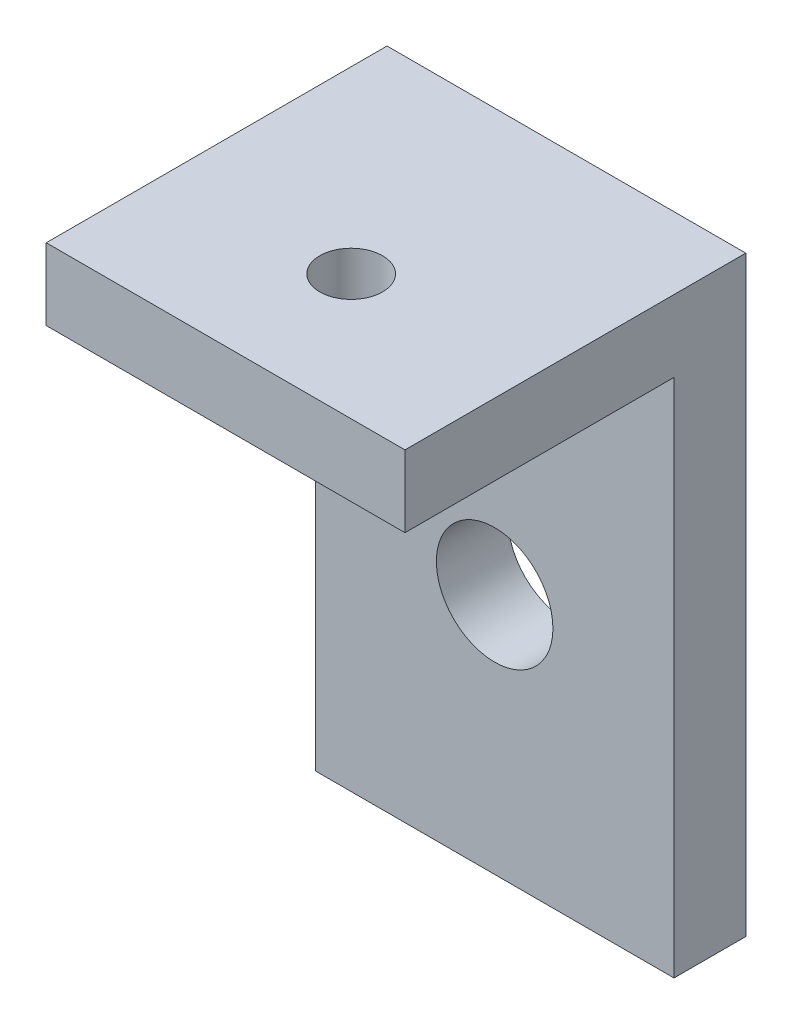
ISO-10303-21;
HEADER;
FILE_DESCRIPTION(('STEP AP214'),'2;1');
FILE_NAME('part.step','',(''),(''),'','','');
FILE_SCHEMA(('AUTOMOTIVE_DESIGN { 1 0 10303 214 1 1 1 1 }'));
ENDSEC;
DATA;
#1=APPLICATION_CONTEXT('core data for automotive mechanical design processes');
#2=APPLICATION_PROTOCOL_DEFINITION('international standard','automotive_design',2000,#1);
#3=PRODUCT_CONTEXT('',#1,'mechanical');
#4=PRODUCT('Part','Part','',(#3));
#5=PRODUCT_RELATED_PRODUCT_CATEGORY('part','',(#4));
#6=PRODUCT_DEFINITION_FORMATION('','',#4);
#7=PRODUCT_DEFINITION_CONTEXT('part definition',#1,'design');
#8=PRODUCT_DEFINITION('design','',#6,#7);
#9=PRODUCT_DEFINITION_SHAPE('','',#8);
#10=(LENGTH_UNIT() NAMED_UNIT(*) SI_UNIT(.MILLI.,.METRE.));
#11=(NAMED_UNIT(*) PLANE_ANGLE_UNIT() SI_UNIT($,.RADIAN.));
#12=(NAMED_UNIT(*) SI_UNIT($,.STERADIAN.) SOLID_ANGLE_UNIT());
#13=UNCERTAINTY_MEASURE_WITH_UNIT(LENGTH_MEASURE(1.E-05),#10,'distance_accuracy_value','');
#14=(GEOMETRIC_REPRESENTATION_CONTEXT(3) GLOBAL_UNCERTAINTY_ASSIGNED_CONTEXT((#13)) GLOBAL_UNIT_ASSIGNED_CONTEXT((#10,
#11,#12)) REPRESENTATION_CONTEXT('',''));
#15=CARTESIAN_POINT('',(0.,0.,0.));
#16=DIRECTION('',(0.,0.,1.));
#17=DIRECTION('',(1.,0.,0.));
#18=AXIS2_PLACEMENT_3D('',#15,#16,#17);
#19=CARTESIAN_POINT('',(0.,0.,4.));
#20=DIRECTION('',(0.,0.,-1.));
#21=DIRECTION('',(-1.,0.,0.));
#22=AXIS2_PLACEMENT_3D('',#19,#20,#21);
#23=PLANE('',#22);
#24=CARTESIAN_POINT('',(10.,13.5,4.));
#25=DIRECTION('',(0.,0.,1.));
#26=DIRECTION('',(1.,0.,0.));
#27=AXIS2_PLACEMENT_3D('',#24,#25,#26);
#28=CIRCLE('',#27,3.25);
#29=CARTESIAN_POINT('',(13.25,13.5,4.));
#30=VERTEX_POINT('',#29);
#31=EDGE_CURVE('E96',#30,#30,#28,.T.);
#32=ORIENTED_EDGE('',*,*,#31,.F.);
#33=EDGE_LOOP('',(#32));
#34=FACE_BOUND('',#33,.T.);
#35=DIRECTION('',(1.,0.,0.));
#36=VECTOR('',#35,1.);
#37=CARTESIAN_POINT('',(0.,29.,4.));
#38=LINE('',#37,#36);
#39=CARTESIAN_POINT('',(0.,29.,4.));
#40=VERTEX_POINT('',#39);
#41=CARTESIAN_POINT('',(20.,29.,4.));
#42=VERTEX_POINT('',#41);
#43=EDGE_CURVE('E49',#40,#42,#38,.T.);
#44=ORIENTED_EDGE('',*,*,#43,.F.);
#45=DIRECTION('',(0.,-1.,0.));
#46=VECTOR('',#45,1.);
#47=CARTESIAN_POINT('',(0.,0.,4.));
#48=LINE('',#47,#46);
#49=CARTESIAN_POINT('',(0.,0.,4.));
#50=VERTEX_POINT('',#49);
#51=EDGE_CURVE('E54',#40,#50,#48,.T.);
#52=ORIENTED_EDGE('',*,*,#51,.T.);
#53=DIRECTION('',(1.,0.,0.));
#54=VECTOR('',#53,1.);
#55=CARTESIAN_POINT('',(20.,0.,4.));
#56=LINE('',#55,#54);
#57=CARTESIAN_POINT('',(20.,0.,4.));
#58=VERTEX_POINT('',#57);
#59=EDGE_CURVE('E85',#50,#58,#56,.T.);
#60=ORIENTED_EDGE('',*,*,#59,.T.);
#61=DIRECTION('',(0.,1.,0.));
#62=VECTOR('',#61,1.);
#63=CARTESIAN_POINT('',(20.,33.,4.));
#64=LINE('',#63,#62);
#65=EDGE_CURVE('E144',#58,#42,#64,.T.);
#66=ORIENTED_EDGE('',*,*,#65,.T.);
#67=EDGE_LOOP('',(#44,#52,#60,#66));
#68=FACE_BOUND('',#67,.T.);
#69=ADVANCED_FACE('F33',(#34,#68),#23,.F.);
#70=CARTESIAN_POINT('',(0.,0.,0.));
#71=DIRECTION('',(0.,0.,-1.));
#72=DIRECTION('',(-1.,0.,0.));
#73=AXIS2_PLACEMENT_3D('',#70,#71,#72);
#74=PLANE('',#73);
#75=DIRECTION('',(1.,0.,0.));
#76=VECTOR('',#75,1.);
#77=CARTESIAN_POINT('',(20.,0.,0.));
#78=LINE('',#77,#76);
#79=CARTESIAN_POINT('',(0.,0.,0.));
#80=VERTEX_POINT('',#79);
#81=CARTESIAN_POINT('',(20.,0.,0.));
#82=VERTEX_POINT('',#81);
#83=EDGE_CURVE('E91',#80,#82,#78,.T.);
#84=ORIENTED_EDGE('',*,*,#83,.F.);
#85=DIRECTION('',(0.,-1.,0.));
#86=VECTOR('',#85,1.);
#87=CARTESIAN_POINT('',(0.,0.,0.));
#88=LINE('',#87,#86);
#89=CARTESIAN_POINT('',(0.,33.,0.));
#90=VERTEX_POINT('',#89);
#91=EDGE_CURVE('E74',#90,#80,#88,.T.);
#92=ORIENTED_EDGE('',*,*,#91,.F.);
#93=DIRECTION('',(-1.,0.,0.));
#94=VECTOR('',#93,1.);
#95=CARTESIAN_POINT('',(0.,33.,0.));
#96=LINE('',#95,#94);
#97=CARTESIAN_POINT('',(20.,33.,0.));
#98=VERTEX_POINT('',#97);
#99=EDGE_CURVE('E86',#98,#90,#96,.T.);
#100=ORIENTED_EDGE('',*,*,#99,.F.);
#101=DIRECTION('',(0.,1.,0.));
#102=VECTOR('',#101,1.);
#103=CARTESIAN_POINT('',(20.,33.,0.));
#104=LINE('',#103,#102);
#105=EDGE_CURVE('E95',#82,#98,#104,.T.);
#106=ORIENTED_EDGE('',*,*,#105,.F.);
#107=EDGE_LOOP('',(#84,#92,#100,#106));
#108=FACE_BOUND('',#107,.T.);
#109=CARTESIAN_POINT('',(10.,13.5,0.));
#110=DIRECTION('',(0.,0.,1.));
#111=DIRECTION('',(1.,0.,0.));
#112=AXIS2_PLACEMENT_3D('',#109,#110,#111);
#113=CIRCLE('',#112,3.25);
#114=CARTESIAN_POINT('',(13.25,13.5,0.));
#115=VERTEX_POINT('',#114);
#116=EDGE_CURVE('E100',#115,#115,#113,.T.);
#117=ORIENTED_EDGE('',*,*,#116,.T.);
#118=EDGE_LOOP('',(#117));
#119=FACE_BOUND('',#118,.T.);
#120=ADVANCED_FACE('F93',(#108,#119),#74,.T.);
#121=CARTESIAN_POINT('',(20.,0.,4.));
#122=DIRECTION('',(0.,1.,0.));
#123=DIRECTION('',(0.,0.,1.));
#124=AXIS2_PLACEMENT_3D('',#121,#122,#123);
#125=PLANE('',#124);
#126=ORIENTED_EDGE('',*,*,#83,.T.);
#127=DIRECTION('',(0.,0.,-1.));
#128=VECTOR('',#127,1.);
#129=CARTESIAN_POINT('',(20.,0.,4.));
#130=LINE('',#129,#128);
#131=EDGE_CURVE('E11',#58,#82,#130,.T.);
#132=ORIENTED_EDGE('',*,*,#131,.F.);
#133=ORIENTED_EDGE('',*,*,#59,.F.);
#134=DIRECTION('',(0.,0.,-1.));
#135=VECTOR('',#134,1.);
#136=CARTESIAN_POINT('',(0.,0.,4.));
#137=LINE('',#136,#135);
#138=EDGE_CURVE('E77',#50,#80,#137,.T.);
#139=ORIENTED_EDGE('',*,*,#138,.T.);
#140=EDGE_LOOP('',(#126,#132,#133,#139));
#141=FACE_BOUND('',#140,.T.);
#142=ADVANCED_FACE('F35',(#141),#125,.F.);
#143=CARTESIAN_POINT('',(20.,33.,4.));
#144=DIRECTION('',(-1.,0.,0.));
#145=DIRECTION('',(0.,0.,1.));
#146=AXIS2_PLACEMENT_3D('',#143,#144,#145);
#147=PLANE('',#146);
#148=ORIENTED_EDGE('',*,*,#105,.T.);
#149=DIRECTION('',(0.,0.,-1.));
#150=VECTOR('',#149,1.);
#151=CARTESIAN_POINT('',(20.,33.,4.));
#152=LINE('',#151,#150);
#153=CARTESIAN_POINT('',(20.,33.,19.));
#154=VERTEX_POINT('',#153);
#155=EDGE_CURVE('E42',#154,#98,#152,.T.);
#156=ORIENTED_EDGE('',*,*,#155,.F.);
#157=DIRECTION('',(0.,1.,0.));
#158=VECTOR('',#157,1.);
#159=CARTESIAN_POINT('',(20.,33.,19.));
#160=LINE('',#159,#158);
#161=CARTESIAN_POINT('',(20.,29.,19.));
#162=VERTEX_POINT('',#161);
#163=EDGE_CURVE('E121',#162,#154,#160,.T.);
#164=ORIENTED_EDGE('',*,*,#163,.F.);
#165=DIRECTION('',(0.,0.,-1.));
#166=VECTOR('',#165,1.);
#167=CARTESIAN_POINT('',(20.,29.,19.));
#168=LINE('',#167,#166);
#169=EDGE_CURVE('E131',#162,#42,#168,.T.);
#170=ORIENTED_EDGE('',*,*,#169,.T.);
#171=ORIENTED_EDGE('',*,*,#65,.F.);
#172=ORIENTED_EDGE('',*,*,#131,.T.);
#173=EDGE_LOOP('',(#148,#156,#164,#170,#171,#172));
#174=FACE_BOUND('',#173,.T.);
#175=ADVANCED_FACE('F118',(#174),#147,.F.);
#176=CARTESIAN_POINT('',(0.,33.,4.));
#177=DIRECTION('',(0.,-1.,0.));
#178=DIRECTION('',(0.,0.,-1.));
#179=AXIS2_PLACEMENT_3D('',#176,#177,#178);
#180=PLANE('',#179);
#181=CARTESIAN_POINT('',(10.,33.,12.));
#182=DIRECTION('',(0.,1.,0.));
#183=DIRECTION('',(0.,0.,1.));
#184=AXIS2_PLACEMENT_3D('',#181,#182,#183);
#185=CIRCLE('',#184,1.75);
#186=CARTESIAN_POINT('',(10.,33.,13.75));
#187=VERTEX_POINT('',#186);
#188=EDGE_CURVE('E154',#187,#187,#185,.T.);
#189=ORIENTED_EDGE('',*,*,#188,.F.);
#190=EDGE_LOOP('',(#189));
#191=FACE_BOUND('',#190,.T.);
#192=ORIENTED_EDGE('',*,*,#99,.T.);
#193=DIRECTION('',(0.,0.,-1.));
#194=VECTOR('',#193,1.);
#195=CARTESIAN_POINT('',(0.,33.,4.));
#196=LINE('',#195,#194);
#197=CARTESIAN_POINT('',(0.,33.,19.));
#198=VERTEX_POINT('',#197);
#199=EDGE_CURVE('E81',#198,#90,#196,.T.);
#200=ORIENTED_EDGE('',*,*,#199,.F.);
#201=DIRECTION('',(-1.,0.,0.));
#202=VECTOR('',#201,1.);
#203=CARTESIAN_POINT('',(0.,33.,19.));
#204=LINE('',#203,#202);
#205=EDGE_CURVE('E114',#154,#198,#204,.T.);
#206=ORIENTED_EDGE('',*,*,#205,.F.);
#207=ORIENTED_EDGE('',*,*,#155,.T.);
#208=EDGE_LOOP('',(#192,#200,#206,#207));
#209=FACE_BOUND('',#208,.T.);
#210=ADVANCED_FACE('F111',(#191,#209),#180,.F.);
#211=CARTESIAN_POINT('',(0.,0.,4.));
#212=DIRECTION('',(1.,0.,0.));
#213=DIRECTION('',(0.,0.,-1.));
#214=AXIS2_PLACEMENT_3D('',#211,#212,#213);
#215=PLANE('',#214);
#216=ORIENTED_EDGE('',*,*,#91,.T.);
#217=ORIENTED_EDGE('',*,*,#138,.F.);
#218=ORIENTED_EDGE('',*,*,#51,.F.);
#219=DIRECTION('',(0.,0.,-1.));
#220=VECTOR('',#219,1.);
#221=CARTESIAN_POINT('',(0.,29.,19.));
#222=LINE('',#221,#220);
#223=CARTESIAN_POINT('',(0.,29.,19.));
#224=VERTEX_POINT('',#223);
#225=EDGE_CURVE('E139',#224,#40,#222,.T.);
#226=ORIENTED_EDGE('',*,*,#225,.F.);
#227=DIRECTION('',(0.,-1.,0.));
#228=VECTOR('',#227,1.);
#229=CARTESIAN_POINT('',(0.,33.,19.));
#230=LINE('',#229,#228);
#231=EDGE_CURVE('E133',#198,#224,#230,.T.);
#232=ORIENTED_EDGE('',*,*,#231,.F.);
#233=ORIENTED_EDGE('',*,*,#199,.T.);
#234=EDGE_LOOP('',(#216,#217,#218,#226,#232,#233));
#235=FACE_BOUND('',#234,.T.);
#236=ADVANCED_FACE('F76',(#235),#215,.F.);
#237=CARTESIAN_POINT('',(10.,13.5,4.));
#238=DIRECTION('',(0.,0.,-1.));
#239=DIRECTION('',(-1.,0.,0.));
#240=AXIS2_PLACEMENT_3D('',#237,#238,#239);
#241=CYLINDRICAL_SURFACE('',#240,3.25);
#242=ORIENTED_EDGE('',*,*,#31,.T.);
#243=EDGE_LOOP('',(#242));
#244=FACE_BOUND('',#243,.T.);
#245=ORIENTED_EDGE('',*,*,#116,.F.);
#246=EDGE_LOOP('',(#245));
#247=FACE_BOUND('',#246,.T.);
#248=ADVANCED_FACE('F178',(#244,#247),#241,.F.);
#249=CARTESIAN_POINT('',(0.,29.,19.));
#250=DIRECTION('',(0.,1.,0.));
#251=DIRECTION('',(0.,0.,1.));
#252=AXIS2_PLACEMENT_3D('',#249,#250,#251);
#253=PLANE('',#252);
#254=CARTESIAN_POINT('',(10.,29.,12.));
#255=DIRECTION('',(0.,1.,0.));
#256=DIRECTION('',(0.,0.,1.));
#257=AXIS2_PLACEMENT_3D('',#254,#255,#256);
#258=CIRCLE('',#257,1.75);
#259=CARTESIAN_POINT('',(10.,29.,13.75));
#260=VERTEX_POINT('',#259);
#261=EDGE_CURVE('E37',#260,#260,#258,.T.);
#262=ORIENTED_EDGE('',*,*,#261,.T.);
#263=EDGE_LOOP('',(#262));
#264=FACE_BOUND('',#263,.T.);
#265=ORIENTED_EDGE('',*,*,#43,.T.);
#266=ORIENTED_EDGE('',*,*,#169,.F.);
#267=DIRECTION('',(1.,0.,0.));
#268=VECTOR('',#267,1.);
#269=CARTESIAN_POINT('',(0.,29.,19.));
#270=LINE('',#269,#268);
#271=EDGE_CURVE('E128',#224,#162,#270,.T.);
#272=ORIENTED_EDGE('',*,*,#271,.F.);
#273=ORIENTED_EDGE('',*,*,#225,.T.);
#274=EDGE_LOOP('',(#265,#266,#272,#273));
#275=FACE_BOUND('',#274,.T.);
#276=ADVANCED_FACE('F148',(#264,#275),#253,.F.);
#277=CARTESIAN_POINT('',(0.,0.,19.));
#278=DIRECTION('',(0.,0.,1.));
#279=DIRECTION('',(1.,0.,0.));
#280=AXIS2_PLACEMENT_3D('',#277,#278,#279);
#281=PLANE('',#280);
#282=ORIENTED_EDGE('',*,*,#231,.T.);
#283=ORIENTED_EDGE('',*,*,#271,.T.);
#284=ORIENTED_EDGE('',*,*,#163,.T.);
#285=ORIENTED_EDGE('',*,*,#205,.T.);
#286=EDGE_LOOP('',(#282,#283,#284,#285));
#287=FACE_BOUND('',#286,.T.);
#288=ADVANCED_FACE('F126',(#287),#281,.T.);
#289=CARTESIAN_POINT('',(10.,18.,12.));
#290=DIRECTION('',(0.,1.,0.));
#291=DIRECTION('',(0.,0.,1.));
#292=AXIS2_PLACEMENT_3D('',#289,#290,#291);
#293=CYLINDRICAL_SURFACE('',#292,1.75);
#294=ORIENTED_EDGE('',*,*,#188,.T.);
#295=EDGE_LOOP('',(#294));
#296=FACE_BOUND('',#295,.T.);
#297=ORIENTED_EDGE('',*,*,#261,.F.);
#298=EDGE_LOOP('',(#297));
#299=FACE_BOUND('',#298,.T.);
#300=ADVANCED_FACE('F162',(#296,#299),#293,.F.);
#301=CLOSED_SHELL('',(#69,#120,#142,#175,#210,#236,#248,#276,#288,#300));
#302=MANIFOLD_SOLID_BREP('B2',#301);
#303=ADVANCED_BREP_SHAPE_REPRESENTATION('',(#18,#302),#14);
#304=SHAPE_DEFINITION_REPRESENTATION(#9,#303);
ENDSEC;
END-ISO-10303-21;
